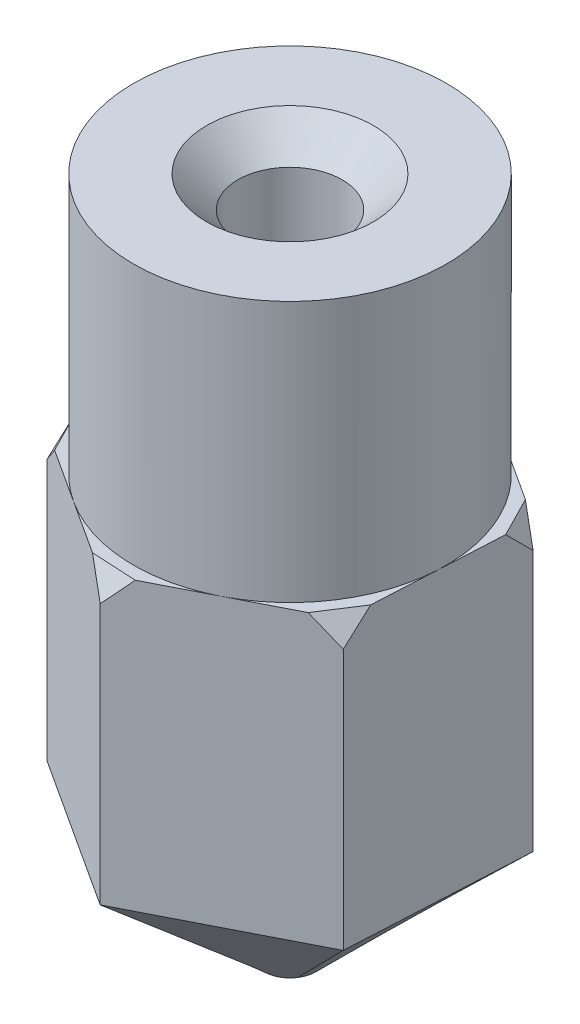
ISO-10303-21;
HEADER;
FILE_DESCRIPTION(('STEP AP214'),'2;1');
FILE_NAME('part.step','',(''),(''),'','','');
FILE_SCHEMA(('AUTOMOTIVE_DESIGN { 1 0 10303 214 1 1 1 1 }'));
ENDSEC;
DATA;
#1=APPLICATION_CONTEXT('core data for automotive mechanical design processes');
#2=APPLICATION_PROTOCOL_DEFINITION('international standard','automotive_design',2000,#1);
#3=PRODUCT_CONTEXT('',#1,'mechanical');
#4=PRODUCT('Part','Part','',(#3));
#5=PRODUCT_RELATED_PRODUCT_CATEGORY('part','',(#4));
#6=PRODUCT_DEFINITION_FORMATION('','',#4);
#7=PRODUCT_DEFINITION_CONTEXT('part definition',#1,'design');
#8=PRODUCT_DEFINITION('design','',#6,#7);
#9=PRODUCT_DEFINITION_SHAPE('','',#8);
#10=(LENGTH_UNIT() NAMED_UNIT(*) SI_UNIT(.MILLI.,.METRE.));
#11=(NAMED_UNIT(*) PLANE_ANGLE_UNIT() SI_UNIT($,.RADIAN.));
#12=(NAMED_UNIT(*) SI_UNIT($,.STERADIAN.) SOLID_ANGLE_UNIT());
#13=UNCERTAINTY_MEASURE_WITH_UNIT(LENGTH_MEASURE(1.E-05),#10,'distance_accuracy_value','');
#14=(GEOMETRIC_REPRESENTATION_CONTEXT(3) GLOBAL_UNCERTAINTY_ASSIGNED_CONTEXT((#13)) GLOBAL_UNIT_ASSIGNED_CONTEXT((#10,
#11,#12)) REPRESENTATION_CONTEXT('',''));
#15=CARTESIAN_POINT('',(0.,0.,0.));
#16=DIRECTION('',(0.,0.,1.));
#17=DIRECTION('',(1.,0.,0.));
#18=AXIS2_PLACEMENT_3D('',#15,#16,#17);
#19=CARTESIAN_POINT('',(0.,5.5,0.));
#20=DIRECTION('',(0.,1.,0.));
#21=DIRECTION('',(0.,0.,1.));
#22=AXIS2_PLACEMENT_3D('',#19,#20,#21);
#23=PLANE('',#22);
#24=DIRECTION('',(0.890736666190286,0.,-0.454519737199845));
#25=VECTOR('',#24,1.);
#26=CARTESIAN_POINT('',(-0.179241950406559,5.5,3.45946127644384));
#27=LINE('',#26,#25);
#28=CARTESIAN_POINT('',(1.36355921159953,5.5,2.67220999857086));
#29=VERTEX_POINT('',#28);
#30=CARTESIAN_POINT('',(2.46099204051048,5.5,2.1122185892978));
#31=VERTEX_POINT('',#30);
#32=EDGE_CURVE('E338',#29,#31,#27,.T.);
#33=ORIENTED_EDGE('',*,*,#32,.T.);
#34=DIRECTION('',(0.544140712403124,0.,-0.838993972031635));
#35=VECTOR('',#34,1.);
#36=CARTESIAN_POINT('',(2.69661188059772,5.5,1.74892354259709));
#37=LINE('',#36,#35);
#38=CARTESIAN_POINT('',(2.93223172068495,5.5,1.38562849589639));
#39=VERTEX_POINT('',#38);
#40=EDGE_CURVE('E102',#31,#39,#37,.T.);
#41=ORIENTED_EDGE('',*,*,#40,.T.);
#42=DIRECTION('',(0.0517426941586506,0.,-0.998660449602969));
#43=VECTOR('',#42,1.);
#44=CARTESIAN_POINT('',(2.90636037360563,5.5,1.88495872069787));
#45=LINE('',#44,#43);
#46=CARTESIAN_POINT('',(2.99598134880891,5.5,0.155228082475952));
#47=VERTEX_POINT('',#46);
#48=EDGE_CURVE('E227',#39,#47,#45,.T.);
#49=ORIENTED_EDGE('',*,*,#48,.T.);
#50=CARTESIAN_POINT('',(0.,5.5,0.));
#51=DIRECTION('',(0.,1.,0.));
#52=DIRECTION('',(0.,0.,1.));
#53=AXIS2_PLACEMENT_3D('',#50,#51,#52);
#54=CIRCLE('',#53,3.);
#55=EDGE_CURVE('E423',#29,#47,#54,.T.);
#56=ORIENTED_EDGE('',*,*,#55,.F.);
#57=EDGE_LOOP('',(#33,#41,#49,#56));
#58=FACE_BOUND('',#57,.T.);
#59=ADVANCED_FACE('F85',(#58),#23,.T.);
#60=DIRECTION('',(0.838993972031635,0.,0.544140712403125));
#61=VECTOR('',#60,1.);
#62=CARTESIAN_POINT('',(-3.08560232401219,5.5,1.57450255574597));
#63=LINE('',#62,#61);
#64=CARTESIAN_POINT('',(-1.63242213720937,5.5,2.5169819160949));
#65=VERTEX_POINT('',#64);
#66=CARTESIAN_POINT('',(-0.598738936422377,5.5,3.18739092024228));
#67=VERTEX_POINT('',#66);
#68=EDGE_CURVE('E342',#65,#67,#63,.T.);
#69=ORIENTED_EDGE('',*,*,#68,.T.);
#70=DIRECTION('',(0.998660449602969,0.,0.0517426941586507));
#71=VECTOR('',#70,1.);
#72=CARTESIAN_POINT('',(-0.166306276866898,5.5,3.2097961640431));
#73=LINE('',#72,#71);
#74=CARTESIAN_POINT('',(0.266126382688585,5.5,3.23220140784392));
#75=VERTEX_POINT('',#74);
#76=EDGE_CURVE('E239',#67,#75,#73,.T.);
#77=ORIENTED_EDGE('',*,*,#76,.T.);
#78=EDGE_CURVE('E221',#75,#29,#27,.T.);
#79=ORIENTED_EDGE('',*,*,#78,.T.);
#80=EDGE_CURVE('E330',#65,#29,#54,.T.);
#81=ORIENTED_EDGE('',*,*,#80,.F.);
#82=EDGE_LOOP('',(#69,#77,#79,#81));
#83=FACE_BOUND('',#82,.T.);
#84=ADVANCED_FACE('F550',(#83),#23,.T.);
#85=DIRECTION('',(-0.0517426941586506,0.,0.998660449602969));
#86=VECTOR('',#85,1.);
#87=CARTESIAN_POINT('',(-2.90636037360563,5.5,-1.88495872069787));
#88=LINE('',#87,#86);
#89=CARTESIAN_POINT('',(-2.9959813488089,5.5,-0.155228082475952));
#90=VERTEX_POINT('',#89);
#91=CARTESIAN_POINT('',(-3.05973097693286,5.5,1.07517233094448));
#92=VERTEX_POINT('',#91);
#93=EDGE_CURVE('E346',#90,#92,#88,.T.);
#94=ORIENTED_EDGE('',*,*,#93,.T.);
#95=DIRECTION('',(0.454519737199845,0.,0.890736666190285));
#96=VECTOR('',#95,1.);
#97=CARTESIAN_POINT('',(-2.86291815746461,5.5,1.46087262144601));
#98=LINE('',#97,#96);
#99=CARTESIAN_POINT('',(-2.66610533799637,5.5,1.84657291194753));
#100=VERTEX_POINT('',#99);
#101=EDGE_CURVE('E257',#92,#100,#98,.T.);
#102=ORIENTED_EDGE('',*,*,#101,.T.);
#103=EDGE_CURVE('E339',#100,#65,#63,.T.);
#104=ORIENTED_EDGE('',*,*,#103,.T.);
#105=EDGE_CURVE('E571',#90,#65,#54,.T.);
#106=ORIENTED_EDGE('',*,*,#105,.F.);
#107=EDGE_LOOP('',(#94,#102,#104,#106));
#108=FACE_BOUND('',#107,.T.);
#109=ADVANCED_FACE('F551',(#108),#23,.T.);
#110=DIRECTION('',(-0.890736666190286,0.,0.454519737199844));
#111=VECTOR('',#110,1.);
#112=CARTESIAN_POINT('',(0.179241950406561,5.5,-3.45946127644384));
#113=LINE('',#112,#111);
#114=CARTESIAN_POINT('',(-1.36355921159953,5.5,-2.67220999857086));
#115=VERTEX_POINT('',#114);
#116=CARTESIAN_POINT('',(-2.46099204051048,5.5,-2.1122185892978));
#117=VERTEX_POINT('',#116);
#118=EDGE_CURVE('E350',#115,#117,#113,.T.);
#119=ORIENTED_EDGE('',*,*,#118,.T.);
#120=DIRECTION('',(-0.544140712403124,0.,0.838993972031635));
#121=VECTOR('',#120,1.);
#122=CARTESIAN_POINT('',(-2.69661188059772,5.5,-1.74892354259709));
#123=LINE('',#122,#121);
#124=CARTESIAN_POINT('',(-2.93223172068495,5.5,-1.38562849589639));
#125=VERTEX_POINT('',#124);
#126=EDGE_CURVE('E269',#117,#125,#123,.T.);
#127=ORIENTED_EDGE('',*,*,#126,.T.);
#128=EDGE_CURVE('E343',#125,#90,#88,.T.);
#129=ORIENTED_EDGE('',*,*,#128,.T.);
#130=EDGE_CURVE('E641',#115,#90,#54,.T.);
#131=ORIENTED_EDGE('',*,*,#130,.F.);
#132=EDGE_LOOP('',(#119,#127,#129,#131));
#133=FACE_BOUND('',#132,.T.);
#134=ADVANCED_FACE('F559',(#133),#23,.T.);
#135=DIRECTION('',(-0.838993972031635,0.,-0.544140712403125));
#136=VECTOR('',#135,1.);
#137=CARTESIAN_POINT('',(3.08560232401219,5.5,-1.57450255574597));
#138=LINE('',#137,#136);
#139=CARTESIAN_POINT('',(1.63242213720937,5.5,-2.51698191609491));
#140=VERTEX_POINT('',#139);
#141=CARTESIAN_POINT('',(0.59873893642238,5.5,-3.18739092024228));
#142=VERTEX_POINT('',#141);
#143=EDGE_CURVE('E354',#140,#142,#138,.T.);
#144=ORIENTED_EDGE('',*,*,#143,.T.);
#145=DIRECTION('',(-0.998660449602969,0.,-0.0517426941586507));
#146=VECTOR('',#145,1.);
#147=CARTESIAN_POINT('',(0.166306276866898,5.5,-3.2097961640431));
#148=LINE('',#147,#146);
#149=CARTESIAN_POINT('',(-0.266126382688582,5.5,-3.23220140784392));
#150=VERTEX_POINT('',#149);
#151=EDGE_CURVE('E281',#142,#150,#148,.T.);
#152=ORIENTED_EDGE('',*,*,#151,.T.);
#153=EDGE_CURVE('E347',#150,#115,#113,.T.);
#154=ORIENTED_EDGE('',*,*,#153,.T.);
#155=EDGE_CURVE('E636',#140,#115,#54,.T.);
#156=ORIENTED_EDGE('',*,*,#155,.F.);
#157=EDGE_LOOP('',(#144,#152,#154,#156));
#158=FACE_BOUND('',#157,.T.);
#159=ADVANCED_FACE('F564',(#158),#23,.T.);
#160=CARTESIAN_POINT('',(3.05973097693286,5.5,-1.07517233094449));
#161=VERTEX_POINT('',#160);
#162=EDGE_CURVE('E313',#47,#161,#45,.T.);
#163=ORIENTED_EDGE('',*,*,#162,.T.);
#164=DIRECTION('',(-0.454519737199845,0.,-0.890736666190285));
#165=VECTOR('',#164,1.);
#166=CARTESIAN_POINT('',(2.86291815746462,5.5,-1.46087262144601));
#167=LINE('',#166,#165);
#168=CARTESIAN_POINT('',(2.66610533799637,5.5,-1.84657291194753));
#169=VERTEX_POINT('',#168);
#170=EDGE_CURVE('E293',#161,#169,#167,.T.);
#171=ORIENTED_EDGE('',*,*,#170,.T.);
#172=EDGE_CURVE('E351',#169,#140,#138,.T.);
#173=ORIENTED_EDGE('',*,*,#172,.T.);
#174=EDGE_CURVE('E297',#47,#140,#54,.T.);
#175=ORIENTED_EDGE('',*,*,#174,.F.);
#176=EDGE_LOOP('',(#163,#171,#173,#175));
#177=FACE_BOUND('',#176,.T.);
#178=ADVANCED_FACE('F556',(#177),#23,.T.);
#179=CARTESIAN_POINT('',(2.90636037360563,5.5,1.88495872069787));
#180=DIRECTION('',(-0.998660449602969,0.,-0.0517426941586506));
#181=DIRECTION('',(-0.0517426941586506,0.,0.998660449602969));
#182=AXIS2_PLACEMENT_3D('',#179,#180,#181);
#183=PLANE('',#182);
#184=DIRECTION('',(0.0365876099164434,0.707106781186547,-0.706159576017066));
#185=VECTOR('',#184,1.);
#186=CARTESIAN_POINT('',(2.91929604714529,5.25,1.63529360829713));
#187=LINE('',#186,#185);
#188=CARTESIAN_POINT('',(2.90636037360563,5.,1.88495872069787));
#189=VERTEX_POINT('',#188);
#190=EDGE_CURVE('E224',#189,#39,#187,.T.);
#191=ORIENTED_EDGE('',*,*,#190,.F.);
#192=DIRECTION('',(0.,-1.,0.));
#193=VECTOR('',#192,1.);
#194=CARTESIAN_POINT('',(2.90636037360563,5.5,1.88495872069787));
#195=LINE('',#194,#193);
#196=CARTESIAN_POINT('',(2.90636037360562,0.,1.88495872069787));
#197=VERTEX_POINT('',#196);
#198=EDGE_CURVE('E211',#189,#197,#195,.T.);
#199=ORIENTED_EDGE('',*,*,#198,.T.);
#200=DIRECTION('',(-0.0517426941586506,0.,0.998660449602969));
#201=VECTOR('',#200,1.);
#202=CARTESIAN_POINT('',(2.90636037360563,0.,1.88495872069787));
#203=LINE('',#202,#201);
#204=CARTESIAN_POINT('',(3.08560232401219,0.,-1.57450255574597));
#205=VERTEX_POINT('',#204);
#206=EDGE_CURVE('E314',#197,#205,#203,.F.);
#207=ORIENTED_EDGE('',*,*,#206,.T.);
#208=DIRECTION('',(0.,-1.,0.));
#209=VECTOR('',#208,1.);
#210=CARTESIAN_POINT('',(3.08560232401219,5.5,-1.57450255574597));
#211=LINE('',#210,#209);
#212=CARTESIAN_POINT('',(3.08560232401219,5.,-1.57450255574597));
#213=VERTEX_POINT('',#212);
#214=EDGE_CURVE('E327',#213,#205,#211,.T.);
#215=ORIENTED_EDGE('',*,*,#214,.F.);
#216=DIRECTION('',(0.0365876099164434,-0.707106781186548,-0.706159576017065));
#217=VECTOR('',#216,1.);
#218=CARTESIAN_POINT('',(2.98304567526924,6.98205080756888,0.404893194876692));
#219=LINE('',#218,#217);
#220=EDGE_CURVE('E289',#161,#213,#219,.T.);
#221=ORIENTED_EDGE('',*,*,#220,.F.);
#222=ORIENTED_EDGE('',*,*,#162,.F.);
#223=ORIENTED_EDGE('',*,*,#48,.F.);
#224=EDGE_LOOP('',(#191,#199,#207,#215,#221,#222,#223));
#225=FACE_BOUND('',#224,.T.);
#226=ADVANCED_FACE('F225',(#225),#183,.F.);
#227=CARTESIAN_POINT('',(3.08560232401219,5.5,-1.57450255574597));
#228=DIRECTION('',(-0.544140712403125,0.,0.838993972031635));
#229=DIRECTION('',(0.838993972031635,0.,0.544140712403125));
#230=AXIS2_PLACEMENT_3D('',#227,#228,#229);
#231=PLANE('',#230);
#232=DIRECTION('',(-0.593258326998205,-0.707106781186548,-0.384765587659928));
#233=VECTOR('',#232,1.);
#234=CARTESIAN_POINT('',(1.84217063021728,6.98205080756888,-2.38094673799413));
#235=LINE('',#234,#233);
#236=CARTESIAN_POINT('',(0.179241950406561,5.,-3.45946127644384));
#237=VERTEX_POINT('',#236);
#238=EDGE_CURVE('E277',#142,#237,#235,.T.);
#239=ORIENTED_EDGE('',*,*,#238,.F.);
#240=ORIENTED_EDGE('',*,*,#143,.F.);
#241=ORIENTED_EDGE('',*,*,#172,.F.);
#242=DIRECTION('',(-0.593258326998206,0.707106781186547,-0.384765587659928));
#243=VECTOR('',#242,1.);
#244=CARTESIAN_POINT('',(2.87585383100428,5.25,-1.71053773384675));
#245=LINE('',#244,#243);
#246=EDGE_CURVE('E285',#213,#169,#245,.T.);
#247=ORIENTED_EDGE('',*,*,#246,.F.);
#248=ORIENTED_EDGE('',*,*,#214,.T.);
#249=DIRECTION('',(0.838993972031635,0.,0.544140712403125));
#250=VECTOR('',#249,1.);
#251=CARTESIAN_POINT('',(3.08560232401219,0.,-1.57450255574597));
#252=LINE('',#251,#250);
#253=CARTESIAN_POINT('',(0.17924195040656,0.,-3.45946127644384));
#254=VERTEX_POINT('',#253);
#255=EDGE_CURVE('E303',#205,#254,#252,.F.);
#256=ORIENTED_EDGE('',*,*,#255,.T.);
#257=DIRECTION('',(0.,-1.,0.));
#258=VECTOR('',#257,1.);
#259=CARTESIAN_POINT('',(0.179241950406561,5.5,-3.45946127644384));
#260=LINE('',#259,#258);
#261=EDGE_CURVE('E331',#237,#254,#260,.T.);
#262=ORIENTED_EDGE('',*,*,#261,.F.);
#263=EDGE_LOOP('',(#239,#240,#241,#247,#248,#256,#262));
#264=FACE_BOUND('',#263,.T.);
#265=ADVANCED_FACE('F599',(#264),#231,.F.);
#266=CARTESIAN_POINT('',(0.179241950406561,5.5,-3.45946127644384));
#267=DIRECTION('',(0.454519737199844,0.,0.890736666190286));
#268=DIRECTION('',(0.890736666190286,0.,-0.454519737199844));
#269=AXIS2_PLACEMENT_3D('',#266,#267,#268);
#270=PLANE('',#269);
#271=DIRECTION('',(-0.629845936914649,-0.707106781186548,0.321393988357137));
#272=VECTOR('',#271,1.);
#273=CARTESIAN_POINT('',(-1.14087504505196,6.98205080756888,-2.78583993287082));
#274=LINE('',#273,#272);
#275=CARTESIAN_POINT('',(-2.90636037360563,5.,-1.88495872069787));
#276=VERTEX_POINT('',#275);
#277=EDGE_CURVE('E265',#117,#276,#274,.T.);
#278=ORIENTED_EDGE('',*,*,#277,.F.);
#279=ORIENTED_EDGE('',*,*,#118,.F.);
#280=ORIENTED_EDGE('',*,*,#153,.F.);
#281=DIRECTION('',(-0.629845936914649,0.707106781186548,0.321393988357137));
#282=VECTOR('',#281,1.);
#283=CARTESIAN_POINT('',(-0.0434422161410111,5.25,-3.34583134214388));
#284=LINE('',#283,#282);
#285=EDGE_CURVE('E273',#237,#150,#284,.T.);
#286=ORIENTED_EDGE('',*,*,#285,.F.);
#287=ORIENTED_EDGE('',*,*,#261,.T.);
#288=DIRECTION('',(0.890736666190286,0.,-0.454519737199844));
#289=VECTOR('',#288,1.);
#290=CARTESIAN_POINT('',(0.179241950406561,0.,-3.45946127644384));
#291=LINE('',#290,#289);
#292=CARTESIAN_POINT('',(-2.90636037360563,0.,-1.88495872069787));
#293=VERTEX_POINT('',#292);
#294=EDGE_CURVE('E298',#254,#293,#291,.F.);
#295=ORIENTED_EDGE('',*,*,#294,.T.);
#296=DIRECTION('',(0.,-1.,0.));
#297=VECTOR('',#296,1.);
#298=CARTESIAN_POINT('',(-2.90636037360563,5.5,-1.88495872069787));
#299=LINE('',#298,#297);
#300=EDGE_CURVE('E324',#276,#293,#299,.T.);
#301=ORIENTED_EDGE('',*,*,#300,.F.);
#302=EDGE_LOOP('',(#278,#279,#280,#286,#287,#295,#301));
#303=FACE_BOUND('',#302,.T.);
#304=ADVANCED_FACE('F588',(#303),#270,.F.);
#305=CARTESIAN_POINT('',(-2.90636037360563,5.5,-1.88495872069787));
#306=DIRECTION('',(0.998660449602969,0.,0.0517426941586506));
#307=DIRECTION('',(0.0517426941586506,0.,-0.998660449602969));
#308=AXIS2_PLACEMENT_3D('',#305,#306,#307);
#309=PLANE('',#308);
#310=DIRECTION('',(-0.0365876099164434,-0.707106781186548,0.706159576017065));
#311=VECTOR('',#310,1.);
#312=CARTESIAN_POINT('',(-2.98304567526924,6.98205080756888,-0.404893194876693));
#313=LINE('',#312,#311);
#314=CARTESIAN_POINT('',(-3.08560232401219,5.,1.57450255574597));
#315=VERTEX_POINT('',#314);
#316=EDGE_CURVE('E253',#92,#315,#313,.T.);
#317=ORIENTED_EDGE('',*,*,#316,.F.);
#318=ORIENTED_EDGE('',*,*,#93,.F.);
#319=ORIENTED_EDGE('',*,*,#128,.F.);
#320=DIRECTION('',(-0.0365876099164434,0.707106781186547,0.706159576017066));
#321=VECTOR('',#320,1.);
#322=CARTESIAN_POINT('',(-2.91929604714529,5.25,-1.63529360829713));
#323=LINE('',#322,#321);
#324=EDGE_CURVE('E261',#276,#125,#323,.T.);
#325=ORIENTED_EDGE('',*,*,#324,.F.);
#326=ORIENTED_EDGE('',*,*,#300,.T.);
#327=DIRECTION('',(0.0517426941586506,0.,-0.998660449602969));
#328=VECTOR('',#327,1.);
#329=CARTESIAN_POINT('',(-2.90636037360563,0.,-1.88495872069787));
#330=LINE('',#329,#328);
#331=CARTESIAN_POINT('',(-3.08560232401219,0.,1.57450255574597));
#332=VERTEX_POINT('',#331);
#333=EDGE_CURVE('E302',#293,#332,#330,.F.);
#334=ORIENTED_EDGE('',*,*,#333,.T.);
#335=DIRECTION('',(0.,-1.,0.));
#336=VECTOR('',#335,1.);
#337=CARTESIAN_POINT('',(-3.08560232401219,5.5,1.57450255574597));
#338=LINE('',#337,#336);
#339=EDGE_CURVE('E321',#315,#332,#338,.T.);
#340=ORIENTED_EDGE('',*,*,#339,.F.);
#341=EDGE_LOOP('',(#317,#318,#319,#325,#326,#334,#340));
#342=FACE_BOUND('',#341,.T.);
#343=ADVANCED_FACE('F583',(#342),#309,.F.);
#344=CARTESIAN_POINT('',(-3.08560232401219,5.5,1.57450255574597));
#345=DIRECTION('',(0.544140712403125,0.,-0.838993972031635));
#346=DIRECTION('',(-0.838993972031635,0.,-0.544140712403125));
#347=AXIS2_PLACEMENT_3D('',#344,#345,#346);
#348=PLANE('',#347);
#349=DIRECTION('',(0.593258326998205,-0.707106781186548,0.384765587659928));
#350=VECTOR('',#349,1.);
#351=CARTESIAN_POINT('',(-1.84217063021728,6.98205080756888,2.38094673799412));
#352=LINE('',#351,#350);
#353=CARTESIAN_POINT('',(-0.179241950406559,5.,3.45946127644384));
#354=VERTEX_POINT('',#353);
#355=EDGE_CURVE('E246',#67,#354,#352,.T.);
#356=ORIENTED_EDGE('',*,*,#355,.F.);
#357=ORIENTED_EDGE('',*,*,#68,.F.);
#358=ORIENTED_EDGE('',*,*,#103,.F.);
#359=DIRECTION('',(0.593258326998206,0.707106781186547,0.384765587659928));
#360=VECTOR('',#359,1.);
#361=CARTESIAN_POINT('',(-2.87585383100428,5.25,1.71053773384675));
#362=LINE('',#361,#360);
#363=EDGE_CURVE('E249',#315,#100,#362,.T.);
#364=ORIENTED_EDGE('',*,*,#363,.F.);
#365=ORIENTED_EDGE('',*,*,#339,.T.);
#366=DIRECTION('',(-0.838993972031635,0.,-0.544140712403125));
#367=VECTOR('',#366,1.);
#368=CARTESIAN_POINT('',(-3.08560232401219,0.,1.57450255574597));
#369=LINE('',#368,#367);
#370=CARTESIAN_POINT('',(-0.179241950406558,0.,3.45946127644384));
#371=VERTEX_POINT('',#370);
#372=EDGE_CURVE('E307',#332,#371,#369,.F.);
#373=ORIENTED_EDGE('',*,*,#372,.T.);
#374=DIRECTION('',(0.,-1.,0.));
#375=VECTOR('',#374,1.);
#376=CARTESIAN_POINT('',(-0.179241950406559,5.5,3.45946127644384));
#377=LINE('',#376,#375);
#378=EDGE_CURVE('E220',#354,#371,#377,.T.);
#379=ORIENTED_EDGE('',*,*,#378,.F.);
#380=EDGE_LOOP('',(#356,#357,#358,#364,#365,#373,#379));
#381=FACE_BOUND('',#380,.T.);
#382=ADVANCED_FACE('F580',(#381),#348,.F.);
#383=CARTESIAN_POINT('',(-0.179241950406559,5.5,3.45946127644384));
#384=DIRECTION('',(-0.454519737199845,0.,-0.890736666190286));
#385=DIRECTION('',(-0.890736666190286,0.,0.454519737199845));
#386=AXIS2_PLACEMENT_3D('',#383,#384,#385);
#387=PLANE('',#386);
#388=DIRECTION('',(0.629845936914649,-0.707106781186548,-0.321393988357138));
#389=VECTOR('',#388,1.);
#390=CARTESIAN_POINT('',(1.14087504505196,6.98205080756887,2.78583993287082));
#391=LINE('',#390,#389);
#392=EDGE_CURVE('E110',#31,#189,#391,.T.);
#393=ORIENTED_EDGE('',*,*,#392,.F.);
#394=ORIENTED_EDGE('',*,*,#32,.F.);
#395=ORIENTED_EDGE('',*,*,#78,.F.);
#396=DIRECTION('',(0.629845936914648,0.707106781186548,-0.321393988357137));
#397=VECTOR('',#396,1.);
#398=CARTESIAN_POINT('',(0.0434422161410131,5.25,3.34583134214388));
#399=LINE('',#398,#397);
#400=EDGE_CURVE('E243',#354,#75,#399,.T.);
#401=ORIENTED_EDGE('',*,*,#400,.F.);
#402=ORIENTED_EDGE('',*,*,#378,.T.);
#403=DIRECTION('',(-0.890736666190286,0.,0.454519737199845));
#404=VECTOR('',#403,1.);
#405=CARTESIAN_POINT('',(-0.179241950406559,0.,3.45946127644384));
#406=LINE('',#405,#404);
#407=EDGE_CURVE('E215',#371,#197,#406,.F.);
#408=ORIENTED_EDGE('',*,*,#407,.T.);
#409=ORIENTED_EDGE('',*,*,#198,.F.);
#410=EDGE_LOOP('',(#393,#394,#395,#401,#402,#408,#409));
#411=FACE_BOUND('',#410,.T.);
#412=ADVANCED_FACE('F213',(#411),#387,.F.);
#413=CARTESIAN_POINT('',(0.,-2.5,0.));
#414=DIRECTION('',(0.,-1.,0.));
#415=DIRECTION('',(0.,0.,-1.));
#416=AXIS2_PLACEMENT_3D('',#413,#414,#415);
#417=PLANE('',#416);
#418=CARTESIAN_POINT('',(0.,-2.5,0.));
#419=DIRECTION('',(0.,-1.,0.));
#420=DIRECTION('',(0.,0.,-1.));
#421=AXIS2_PLACEMENT_3D('',#418,#419,#420);
#422=CIRCLE('',#421,0.2);
#423=CARTESIAN_POINT('',(0.,-2.5,-0.2));
#424=VERTEX_POINT('',#423);
#425=EDGE_CURVE('E853',#424,#424,#422,.T.);
#426=ORIENTED_EDGE('',*,*,#425,.F.);
#427=EDGE_LOOP('',(#426));
#428=FACE_BOUND('',#427,.T.);
#429=CARTESIAN_POINT('',(0.,-2.5,0.));
#430=DIRECTION('',(0.,-1.,0.));
#431=DIRECTION('',(0.,0.,-1.));
#432=AXIS2_PLACEMENT_3D('',#429,#430,#431);
#433=CIRCLE('',#432,0.5);
#434=CARTESIAN_POINT('',(-0.419496986015818,-2.5,-0.272070356201562));
#435=VERTEX_POINT('',#434);
#436=CARTESIAN_POINT('',(0.0258713470793253,-2.5,-0.499330224801485));
#437=VERTEX_POINT('',#436);
#438=EDGE_CURVE('E433',#435,#437,#433,.T.);
#439=ORIENTED_EDGE('',*,*,#438,.T.);
#440=CARTESIAN_POINT('',(0.445368333095143,-2.5,-0.227259868599923));
#441=VERTEX_POINT('',#440);
#442=EDGE_CURVE('E435',#437,#441,#433,.T.);
#443=ORIENTED_EDGE('',*,*,#442,.T.);
#444=CARTESIAN_POINT('',(0.419496986015817,-2.5,0.272070356201563));
#445=VERTEX_POINT('',#444);
#446=EDGE_CURVE('E436',#441,#445,#433,.T.);
#447=ORIENTED_EDGE('',*,*,#446,.T.);
#448=CARTESIAN_POINT('',(-0.025871347079325,-2.5,0.499330224801485));
#449=VERTEX_POINT('',#448);
#450=EDGE_CURVE('E418',#445,#449,#433,.T.);
#451=ORIENTED_EDGE('',*,*,#450,.T.);
#452=CARTESIAN_POINT('',(-0.445368333095143,-2.5,0.227259868599923));
#453=VERTEX_POINT('',#452);
#454=EDGE_CURVE('E410',#449,#453,#433,.T.);
#455=ORIENTED_EDGE('',*,*,#454,.T.);
#456=EDGE_CURVE('E419',#453,#435,#433,.T.);
#457=ORIENTED_EDGE('',*,*,#456,.T.);
#458=EDGE_LOOP('',(#439,#443,#447,#451,#455,#457));
#459=FACE_BOUND('',#458,.T.);
#460=ADVANCED_FACE('F363',(#428,#459),#417,.T.);
#461=CARTESIAN_POINT('',(-0.419496986015818,-2.5,-0.272070356201562));
#462=CARTESIAN_POINT('',(-2.90636037360563,0.,-1.88495872069787));
#463=CARTESIAN_POINT('',(-0.464842045382745,-2.5,-0.202154191865592));
#464=CARTESIAN_POINT('',(-2.93623403200672,0.,-1.30838184129057));
#465=CARTESIAN_POINT('',(-0.494708753763478,-2.5,-0.115068100740664));
#466=CARTESIAN_POINT('',(-2.96610769040781,0.,-0.73180496188326));
#467=CARTESIAN_POINT('',(-0.503951695839492,-2.5,0.0633254065820142));
#468=CARTESIAN_POINT('',(-3.02585500721,0.,0.421348796931353));
#469=CARTESIAN_POINT('',(-0.483244977861796,-2.5,0.153031813084065));
#470=CARTESIAN_POINT('',(-3.05572866561109,0.,0.99792567633866));
#471=CARTESIAN_POINT('',(-0.445368333095143,-2.5,0.227259868599923));
#472=CARTESIAN_POINT('',(-3.08560232401219,0.,1.57450255574597));
#473=B_SPLINE_SURFACE_WITH_KNOTS('',3,1,((#461,#462),(#463,#464),(#465,#466),(#467,#468),(#469,
#470),(#471,#472)),.UNSPECIFIED.,.F.,.F.,.F.,(4,2,4),(2,2),(0.,0.5,1.),(0.,1.),.UNSPECIFIED.);
#474=DIRECTION('',(-0.68089120886756,0.644726197763122,0.347441062059136));
#475=VECTOR('',#474,1.);
#476=CARTESIAN_POINT('',(-1.76548532855366,-1.25,0.900881212172945));
#477=LINE('',#476,#475);
#478=EDGE_CURVE('E449',#453,#332,#477,.T.);
#479=DIRECTION('',(0.641338390494838,-0.644726197763122,0.415948553063235));
#480=VECTOR('',#479,1.);
#481=CARTESIAN_POINT('',(-1.66292867981072,-1.25,-1.07851453844972));
#482=LINE('',#481,#480);
#483=EDGE_CURVE('E446',#293,#435,#482,.T.);
#484=ORIENTED_EDGE('',*,*,#456,.F.);
#485=ORIENTED_EDGE('',*,*,#478,.T.);
#486=ORIENTED_EDGE('',*,*,#333,.F.);
#487=ORIENTED_EDGE('',*,*,#483,.T.);
#488=EDGE_LOOP('',(#484,#485,#486,#487));
#489=FACE_BOUND('',#488,.T.);
#490=ADVANCED_FACE('F373',(#489),#473,.T.);
#491=CARTESIAN_POINT('',(-0.445368333095143,-2.5,0.227259868599923));
#492=CARTESIAN_POINT('',(-3.08560232401219,0.,1.57450255574597));
#493=CARTESIAN_POINT('',(-0.407491688328489,-2.5,0.30148792411578));
#494=CARTESIAN_POINT('',(-2.60120892841125,0.,1.88866234252895));
#495=CARTESIAN_POINT('',(-0.347006275288381,-2.5,0.37089629786338));
#496=CARTESIAN_POINT('',(-2.11681553281031,0.,2.20282212931193));
#497=CARTESIAN_POINT('',(-0.197134437114743,-2.5,0.468097674168255));
#498=CARTESIAN_POINT('',(-1.14802874160843,0.,2.83114170287788));
#499=CARTESIAN_POINT('',(-0.109093051212906,-2.5,0.495018333621597));
#500=CARTESIAN_POINT('',(-0.663635346007496,0.,3.14530148966086));
#501=CARTESIAN_POINT('',(-0.025871347079325,-2.5,0.499330224801485));
#502=CARTESIAN_POINT('',(-0.179241950406559,0.,3.45946127644384));
#503=B_SPLINE_SURFACE_WITH_KNOTS('',3,1,((#491,#492),(#493,#494),(#495,#496),(#497,#498),(#499,
#500),(#501,#502)),.UNSPECIFIED.,.F.,.F.,.F.,(4,2,4),(2,2),(0.,0.5,1.),(0.,1.),.UNSPECIFIED.);
#504=DIRECTION('',(-0.0395528183727214,0.644726197763122,0.763389615122371));
#505=VECTOR('',#504,1.);
#506=CARTESIAN_POINT('',(-0.102556648742942,-1.25,1.97939575062266));
#507=LINE('',#506,#505);
#508=EDGE_CURVE('E456',#449,#371,#507,.T.);
#509=ORIENTED_EDGE('',*,*,#454,.F.);
#510=ORIENTED_EDGE('',*,*,#508,.T.);
#511=ORIENTED_EDGE('',*,*,#372,.F.);
#512=ORIENTED_EDGE('',*,*,#478,.F.);
#513=EDGE_LOOP('',(#509,#510,#511,#512));
#514=FACE_BOUND('',#513,.T.);
#515=ADVANCED_FACE('F528',(#514),#503,.T.);
#516=CARTESIAN_POINT('',(0.0258713470793255,-2.5,-0.499330224801485));
#517=CARTESIAN_POINT('',(0.179241950406561,0.,-3.45946127644384));
#518=CARTESIAN_POINT('',(-0.0573503570542552,-2.5,-0.503642115981372));
#519=CARTESIAN_POINT('',(-0.33502510359547,0.,-3.19704418381951));
#520=CARTESIAN_POINT('',(-0.147702478475096,-2.5,-0.485964398604044));
#521=CARTESIAN_POINT('',(-0.849292157597501,0.,-2.93462709119518));
#522=CARTESIAN_POINT('',(-0.306817258724748,-2.5,-0.404772267586241));
#523=CARTESIAN_POINT('',(-1.87782626560156,0.,-2.40979290594653));
#524=CARTESIAN_POINT('',(-0.374151926648891,-2.5,-0.341986520537532));
#525=CARTESIAN_POINT('',(-2.39209331960359,0.,-2.1473758133222));
#526=CARTESIAN_POINT('',(-0.419496986015818,-2.5,-0.272070356201562));
#527=CARTESIAN_POINT('',(-2.90636037360563,0.,-1.88495872069787));
#528=B_SPLINE_SURFACE_WITH_KNOTS('',3,1,((#516,#517),(#518,#519),(#520,#521),(#522,#523),(#524,
#525),(#526,#527)),.UNSPECIFIED.,.F.,.F.,.F.,(4,2,4),(2,2),(0.,0.5,1.),(0.,1.),.UNSPECIFIED.);
#529=DIRECTION('',(0.039552818372722,0.644726197763122,-0.763389615122371));
#530=VECTOR('',#529,1.);
#531=CARTESIAN_POINT('',(0.102556648742943,-1.25,-1.97939575062266));
#532=LINE('',#531,#530);
#533=EDGE_CURVE('E317',#437,#254,#532,.T.);
#534=ORIENTED_EDGE('',*,*,#438,.F.);
#535=ORIENTED_EDGE('',*,*,#483,.F.);
#536=ORIENTED_EDGE('',*,*,#294,.F.);
#537=ORIENTED_EDGE('',*,*,#533,.F.);
#538=EDGE_LOOP('',(#534,#535,#536,#537));
#539=FACE_BOUND('',#538,.T.);
#540=ADVANCED_FACE('F488',(#539),#528,.T.);
#541=CARTESIAN_POINT('',(-0.025871347079325,-2.5,0.499330224801485));
#542=CARTESIAN_POINT('',(-0.179241950406559,0.,3.45946127644384));
#543=CARTESIAN_POINT('',(0.0573503570542557,-2.5,0.503642115981372));
#544=CARTESIAN_POINT('',(0.335025103595472,0.,3.19704418381951));
#545=CARTESIAN_POINT('',(0.147702478475096,-2.5,0.485964398604044));
#546=CARTESIAN_POINT('',(0.849292157597503,0.,2.93462709119518));
#547=CARTESIAN_POINT('',(0.306817258724748,-2.5,0.404772267586241));
#548=CARTESIAN_POINT('',(1.87782626560156,0.,2.40979290594653));
#549=CARTESIAN_POINT('',(0.37415192664889,-2.5,0.341986520537532));
#550=CARTESIAN_POINT('',(2.39209331960359,0.,2.1473758133222));
#551=CARTESIAN_POINT('',(0.419496986015817,-2.5,0.272070356201563));
#552=CARTESIAN_POINT('',(2.90636037360562,0.,1.88495872069787));
#553=B_SPLINE_SURFACE_WITH_KNOTS('',3,1,((#541,#542),(#543,#544),(#545,#546),(#547,#548),(#549,
#550),(#551,#552)),.UNSPECIFIED.,.F.,.F.,.F.,(4,2,4),(2,2),(0.,0.5,1.),(0.,1.),.UNSPECIFIED.);
#554=DIRECTION('',(0.641338390494838,0.644726197763122,0.415948553063235));
#555=VECTOR('',#554,1.);
#556=CARTESIAN_POINT('',(1.66292867981072,-1.25,1.07851453844972));
#557=LINE('',#556,#555);
#558=EDGE_CURVE('E614',#445,#197,#557,.T.);
#559=ORIENTED_EDGE('',*,*,#450,.F.);
#560=ORIENTED_EDGE('',*,*,#558,.T.);
#561=ORIENTED_EDGE('',*,*,#407,.F.);
#562=ORIENTED_EDGE('',*,*,#508,.F.);
#563=EDGE_LOOP('',(#559,#560,#561,#562));
#564=FACE_BOUND('',#563,.T.);
#565=ADVANCED_FACE('F475',(#564),#553,.T.);
#566=CARTESIAN_POINT('',(0.419496986015817,-2.5,0.272070356201563));
#567=CARTESIAN_POINT('',(2.90636037360563,0.,1.88495872069787));
#568=CARTESIAN_POINT('',(0.464842045382744,-2.5,0.202154191865593));
#569=CARTESIAN_POINT('',(2.93623403200672,0.,1.30838184129057));
#570=CARTESIAN_POINT('',(0.494708753763478,-2.5,0.115068100740665));
#571=CARTESIAN_POINT('',(2.96610769040781,0.,0.731804961883259));
#572=CARTESIAN_POINT('',(0.503951695839492,-2.5,-0.0633254065820139));
#573=CARTESIAN_POINT('',(3.02585500721,0.,-0.421348796931355));
#574=CARTESIAN_POINT('',(0.483244977861797,-2.5,-0.153031813084065));
#575=CARTESIAN_POINT('',(3.05572866561109,0.,-0.997925676338662));
#576=CARTESIAN_POINT('',(0.445368333095143,-2.5,-0.227259868599923));
#577=CARTESIAN_POINT('',(3.08560232401219,0.,-1.57450255574597));
#578=B_SPLINE_SURFACE_WITH_KNOTS('',3,1,((#566,#567),(#568,#569),(#570,#571),(#572,#573),(#574,
#575),(#576,#577)),.UNSPECIFIED.,.F.,.F.,.F.,(4,2,4),(2,2),(0.,0.5,1.),(0.,1.),.UNSPECIFIED.);
#579=DIRECTION('',(0.680891208867559,0.644726197763122,-0.347441062059137));
#580=VECTOR('',#579,1.);
#581=CARTESIAN_POINT('',(1.76548532855366,-1.25,-0.900881212172946));
#582=LINE('',#581,#580);
#583=EDGE_CURVE('E596',#441,#205,#582,.T.);
#584=ORIENTED_EDGE('',*,*,#446,.F.);
#585=ORIENTED_EDGE('',*,*,#583,.T.);
#586=ORIENTED_EDGE('',*,*,#206,.F.);
#587=ORIENTED_EDGE('',*,*,#558,.F.);
#588=EDGE_LOOP('',(#584,#585,#586,#587));
#589=FACE_BOUND('',#588,.T.);
#590=ADVANCED_FACE('F487',(#589),#578,.T.);
#591=CARTESIAN_POINT('',(0.445368333095143,-2.5,-0.227259868599922));
#592=CARTESIAN_POINT('',(3.08560232401219,0.,-1.57450255574597));
#593=CARTESIAN_POINT('',(0.407491688328489,-2.5,-0.301487924115779));
#594=CARTESIAN_POINT('',(2.60120892841125,0.,-1.88866234252895));
#595=CARTESIAN_POINT('',(0.347006275288381,-2.5,-0.37089629786338));
#596=CARTESIAN_POINT('',(2.11681553281031,0.,-2.20282212931193));
#597=CARTESIAN_POINT('',(0.197134437114743,-2.5,-0.468097674168255));
#598=CARTESIAN_POINT('',(1.14802874160844,0.,-2.83114170287788));
#599=CARTESIAN_POINT('',(0.109093051212906,-2.5,-0.495018333621597));
#600=CARTESIAN_POINT('',(0.663635346007501,0.,-3.14530148966086));
#601=CARTESIAN_POINT('',(0.0258713470793253,-2.5,-0.499330224801485));
#602=CARTESIAN_POINT('',(0.179241950406561,0.,-3.45946127644384));
#603=B_SPLINE_SURFACE_WITH_KNOTS('',3,1,((#591,#592),(#593,#594),(#595,#596),(#597,#598),(#599,
#600),(#601,#602)),.UNSPECIFIED.,.F.,.F.,.F.,(4,2,4),(2,2),(0.,0.5,1.),(0.,1.),.UNSPECIFIED.);
#604=ORIENTED_EDGE('',*,*,#442,.F.);
#605=ORIENTED_EDGE('',*,*,#533,.T.);
#606=ORIENTED_EDGE('',*,*,#255,.F.);
#607=ORIENTED_EDGE('',*,*,#583,.F.);
#608=EDGE_LOOP('',(#604,#605,#606,#607));
#609=FACE_BOUND('',#608,.T.);
#610=ADVANCED_FACE('F502',(#609),#603,.T.);
#611=CARTESIAN_POINT('',(0.,10.5,0.));
#612=DIRECTION('',(0.,-1.,0.));
#613=DIRECTION('',(0.,0.,-1.));
#614=AXIS2_PLACEMENT_3D('',#611,#612,#613);
#615=CYLINDRICAL_SURFACE('',#614,3.);
#616=CARTESIAN_POINT('',(0.,10.5,0.));
#617=DIRECTION('',(0.,1.,0.));
#618=DIRECTION('',(0.,0.,1.));
#619=AXIS2_PLACEMENT_3D('',#616,#617,#618);
#620=CIRCLE('',#619,3.);
#621=CARTESIAN_POINT('',(0.,10.5,3.));
#622=VERTEX_POINT('',#621);
#623=EDGE_CURVE('E649',#622,#622,#620,.T.);
#624=ORIENTED_EDGE('',*,*,#623,.F.);
#625=EDGE_LOOP('',(#624));
#626=FACE_BOUND('',#625,.T.);
#627=ORIENTED_EDGE('',*,*,#55,.T.);
#628=ORIENTED_EDGE('',*,*,#174,.T.);
#629=ORIENTED_EDGE('',*,*,#155,.T.);
#630=ORIENTED_EDGE('',*,*,#130,.T.);
#631=ORIENTED_EDGE('',*,*,#105,.T.);
#632=ORIENTED_EDGE('',*,*,#80,.T.);
#633=EDGE_LOOP('',(#627,#628,#629,#630,#631,#632));
#634=FACE_BOUND('',#633,.T.);
#635=ADVANCED_FACE('F375',(#626,#634),#615,.T.);
#636=CARTESIAN_POINT('',(0.,10.5,0.));
#637=DIRECTION('',(0.,1.,0.));
#638=DIRECTION('',(0.,0.,1.));
#639=AXIS2_PLACEMENT_3D('',#636,#637,#638);
#640=PLANE('',#639);
#641=CARTESIAN_POINT('',(0.,10.5,0.));
#642=DIRECTION('',(0.,1.,0.));
#643=DIRECTION('',(0.,0.,1.));
#644=AXIS2_PLACEMENT_3D('',#641,#642,#643);
#645=CIRCLE('',#644,1.59999999999999);
#646=CARTESIAN_POINT('',(0.,10.5,1.59999999999999));
#647=VERTEX_POINT('',#646);
#648=EDGE_CURVE('E12',#647,#647,#645,.F.);
#649=ORIENTED_EDGE('',*,*,#648,.T.);
#650=EDGE_LOOP('',(#649));
#651=FACE_BOUND('',#650,.T.);
#652=ORIENTED_EDGE('',*,*,#623,.T.);
#653=EDGE_LOOP('',(#652));
#654=FACE_BOUND('',#653,.T.);
#655=ADVANCED_FACE('F660',(#651,#654),#640,.T.);
#656=CARTESIAN_POINT('',(4.24995519159032,2.3856406460551,-2.16864151899647));
#657=DIRECTION('',(0.796699094261207,0.447213595499958,-0.406534811797677));
#658=DIRECTION('',(-0.489488091597962,0.872009981699628,0.));
#659=AXIS2_PLACEMENT_3D('',#656,#657,#658);
#660=PLANE('',#659);
#661=ORIENTED_EDGE('',*,*,#170,.F.);
#662=ORIENTED_EDGE('',*,*,#220,.T.);
#663=ORIENTED_EDGE('',*,*,#246,.T.);
#664=EDGE_LOOP('',(#661,#662,#663));
#665=FACE_BOUND('',#664,.T.);
#666=ADVANCED_FACE('F604',(#665),#660,.T.);
#667=CARTESIAN_POINT('',(0.24687894864255,2.3856406460551,-4.76488992036101));
#668=DIRECTION('',(0.0462800725910897,0.447213595499957,-0.893229060701097));
#669=DIRECTION('',(0.,0.894187179234152,0.44769329735129));
#670=AXIS2_PLACEMENT_3D('',#667,#668,#669);
#671=PLANE('',#670);
#672=ORIENTED_EDGE('',*,*,#151,.F.);
#673=ORIENTED_EDGE('',*,*,#238,.T.);
#674=ORIENTED_EDGE('',*,*,#285,.T.);
#675=EDGE_LOOP('',(#672,#673,#674));
#676=FACE_BOUND('',#675,.T.);
#677=ADVANCED_FACE('F638',(#676),#671,.T.);
#678=CARTESIAN_POINT('',(-4.00307624294777,2.3856406460551,-2.59624840136455));
#679=DIRECTION('',(-0.750419021670117,0.447213595499958,-0.48669424890342));
#680=DIRECTION('',(-0.544140712403124,0.,0.838993972031635));
#681=AXIS2_PLACEMENT_3D('',#678,#679,#680);
#682=PLANE('',#681);
#683=ORIENTED_EDGE('',*,*,#126,.F.);
#684=ORIENTED_EDGE('',*,*,#277,.T.);
#685=ORIENTED_EDGE('',*,*,#324,.T.);
#686=EDGE_LOOP('',(#683,#684,#685));
#687=FACE_BOUND('',#686,.T.);
#688=ADVANCED_FACE('F764',(#687),#682,.T.);
#689=CARTESIAN_POINT('',(-4.24995519159032,2.3856406460551,2.16864151899646));
#690=DIRECTION('',(-0.796699094261207,0.447213595499958,0.406534811797677));
#691=DIRECTION('',(-0.489488091597962,-0.872009981699628,0.));
#692=AXIS2_PLACEMENT_3D('',#689,#690,#691);
#693=PLANE('',#692);
#694=ORIENTED_EDGE('',*,*,#101,.F.);
#695=ORIENTED_EDGE('',*,*,#316,.T.);
#696=ORIENTED_EDGE('',*,*,#363,.T.);
#697=EDGE_LOOP('',(#694,#695,#696));
#698=FACE_BOUND('',#697,.T.);
#699=ADVANCED_FACE('F576',(#698),#693,.T.);
#700=CARTESIAN_POINT('',(-0.24687894864255,2.3856406460551,4.76488992036101));
#701=DIRECTION('',(-0.0462800725910898,0.447213595499957,0.893229060701097));
#702=DIRECTION('',(0.,-0.894187179234152,0.44769329735129));
#703=AXIS2_PLACEMENT_3D('',#700,#701,#702);
#704=PLANE('',#703);
#705=ORIENTED_EDGE('',*,*,#76,.F.);
#706=ORIENTED_EDGE('',*,*,#355,.T.);
#707=ORIENTED_EDGE('',*,*,#400,.T.);
#708=EDGE_LOOP('',(#705,#706,#707));
#709=FACE_BOUND('',#708,.T.);
#710=ADVANCED_FACE('F624',(#709),#704,.T.);
#711=CARTESIAN_POINT('',(4.00307624294777,2.3856406460551,2.59624840136454));
#712=DIRECTION('',(0.750419021670117,0.447213595499958,0.48669424890342));
#713=DIRECTION('',(0.544140712403124,0.,-0.838993972031635));
#714=AXIS2_PLACEMENT_3D('',#711,#712,#713);
#715=PLANE('',#714);
#716=ORIENTED_EDGE('',*,*,#40,.F.);
#717=ORIENTED_EDGE('',*,*,#392,.T.);
#718=ORIENTED_EDGE('',*,*,#190,.T.);
#719=EDGE_LOOP('',(#716,#717,#718));
#720=FACE_BOUND('',#719,.T.);
#721=ADVANCED_FACE('F231',(#720),#715,.T.);
#722=CARTESIAN_POINT('',(0.,-0.162425937937654,0.));
#723=DIRECTION('',(0.,1.,0.));
#724=DIRECTION('',(0.,0.,1.));
#725=AXIS2_PLACEMENT_3D('',#722,#723,#724);
#726=CONICAL_SURFACE('',#725,0.999999999999999,0.540179403492243);
#727=CARTESIAN_POINT('',(0.,-1.49648518758754,0.));
#728=DIRECTION('',(0.,1.,0.));
#729=DIRECTION('',(0.,0.,1.));
#730=AXIS2_PLACEMENT_3D('',#727,#728,#729);
#731=CIRCLE('',#730,0.2);
#732=CARTESIAN_POINT('',(0.,-1.49648518758754,0.2));
#733=VERTEX_POINT('',#732);
#734=EDGE_CURVE('E656',#733,#733,#731,.T.);
#735=CARTESIAN_POINT('',(0.,-0.162425937937654,0.));
#736=DIRECTION('',(0.,1.,0.));
#737=DIRECTION('',(0.,0.,1.));
#738=AXIS2_PLACEMENT_3D('',#735,#736,#737);
#739=CIRCLE('',#738,0.999999999999999);
#740=CARTESIAN_POINT('',(0.,-0.162425937937654,0.999999999999999));
#741=VERTEX_POINT('',#740);
#742=EDGE_CURVE('E650',#741,#741,#739,.T.);
#743=CARTESIAN_POINT('',(0.,-1.49648518758754,0.2));
#744=CARTESIAN_POINT('',(0.,-1.48258873707035,0.208333333333333));
#745=CARTESIAN_POINT('',(0.,-1.46869228655316,0.216666666666667));
#746=CARTESIAN_POINT('',(0.,-1.44089938551879,0.233333333333333));
#747=CARTESIAN_POINT('',(0.,-1.4270029350016,0.241666666666666));
#748=CARTESIAN_POINT('',(0.,-1.39921003396723,0.258333333333333));
#749=CARTESIAN_POINT('',(0.,-1.38531358345005,0.266666666666666));
#750=CARTESIAN_POINT('',(0.,-1.35752068241567,0.283333333333333));
#751=CARTESIAN_POINT('',(0.,-1.34362423189849,0.291666666666666));
#752=CARTESIAN_POINT('',(0.,-1.31583133086411,0.308333333333333));
#753=CARTESIAN_POINT('',(0.,-1.30193488034693,0.316666666666666));
#754=CARTESIAN_POINT('',(0.,-1.27414197931256,0.333333333333333));
#755=CARTESIAN_POINT('',(0.,-1.26024552879537,0.341666666666666));
#756=CARTESIAN_POINT('',(0.,-1.232452627761,0.358333333333333));
#757=CARTESIAN_POINT('',(0.,-1.21855617724381,0.366666666666666));
#758=CARTESIAN_POINT('',(0.,-1.19076327620944,0.383333333333333));
#759=CARTESIAN_POINT('',(0.,-1.17686682569225,0.391666666666666));
#760=CARTESIAN_POINT('',(0.,-1.14907392465788,0.408333333333333));
#761=CARTESIAN_POINT('',(0.,-1.13517747414069,0.416666666666666));
#762=CARTESIAN_POINT('',(0.,-1.10738457310632,0.433333333333333));
#763=CARTESIAN_POINT('',(0.,-1.09348812258913,0.441666666666666));
#764=CARTESIAN_POINT('',(0.,-1.06569522155476,0.458333333333333));
#765=CARTESIAN_POINT('',(0.,-1.05179877103758,0.466666666666666));
#766=CARTESIAN_POINT('',(0.,-1.0240058700032,0.483333333333333));
#767=CARTESIAN_POINT('',(0.,-1.01010941948602,0.491666666666666));
#768=CARTESIAN_POINT('',(0.,-0.982316518451644,0.508333333333333));
#769=CARTESIAN_POINT('',(0.,-0.968420067934458,0.516666666666666));
#770=CARTESIAN_POINT('',(0.,-0.940627166900085,0.533333333333332));
#771=CARTESIAN_POINT('',(0.,-0.926730716382899,0.541666666666666));
#772=CARTESIAN_POINT('',(0.,-0.898937815348526,0.558333333333333));
#773=CARTESIAN_POINT('',(0.,-0.88504136483134,0.566666666666666));
#774=CARTESIAN_POINT('',(0.,-0.857248463796967,0.583333333333332));
#775=CARTESIAN_POINT('',(0.,-0.843352013279781,0.591666666666666));
#776=CARTESIAN_POINT('',(0.,-0.815559112245408,0.608333333333333));
#777=CARTESIAN_POINT('',(0.,-0.801662661728222,0.616666666666666));
#778=CARTESIAN_POINT('',(0.,-0.77386976069385,0.633333333333332));
#779=CARTESIAN_POINT('',(0.,-0.759973310176663,0.641666666666666));
#780=CARTESIAN_POINT('',(0.,-0.732180409142291,0.658333333333332));
#781=CARTESIAN_POINT('',(0.,-0.718283958625105,0.666666666666666));
#782=CARTESIAN_POINT('',(0.,-0.690491057590732,0.683333333333332));
#783=CARTESIAN_POINT('',(0.,-0.676594607073546,0.691666666666666));
#784=CARTESIAN_POINT('',(0.,-0.648801706039173,0.708333333333332));
#785=CARTESIAN_POINT('',(0.,-0.634905255521987,0.716666666666666));
#786=CARTESIAN_POINT('',(0.,-0.607112354487614,0.733333333333332));
#787=CARTESIAN_POINT('',(0.,-0.593215903970428,0.741666666666666));
#788=CARTESIAN_POINT('',(0.,-0.565423002936056,0.758333333333332));
#789=CARTESIAN_POINT('',(0.,-0.551526552418869,0.766666666666666));
#790=CARTESIAN_POINT('',(0.,-0.523733651384497,0.783333333333332));
#791=CARTESIAN_POINT('',(0.,-0.509837200867311,0.791666666666665));
#792=CARTESIAN_POINT('',(0.,-0.482044299832938,0.808333333333332));
#793=CARTESIAN_POINT('',(0.,-0.468147849315752,0.816666666666665));
#794=CARTESIAN_POINT('',(0.,-0.440354948281379,0.833333333333332));
#795=CARTESIAN_POINT('',(0.,-0.426458497764193,0.841666666666665));
#796=CARTESIAN_POINT('',(0.,-0.39866559672982,0.858333333333332));
#797=CARTESIAN_POINT('',(0.,-0.384769146212634,0.866666666666665));
#798=CARTESIAN_POINT('',(0.,-0.356976245178262,0.883333333333332));
#799=CARTESIAN_POINT('',(0.,-0.343079794661075,0.891666666666665));
#800=CARTESIAN_POINT('',(0.,-0.315286893626703,0.908333333333332));
#801=CARTESIAN_POINT('',(0.,-0.301390443109516,0.916666666666665));
#802=CARTESIAN_POINT('',(0.,-0.273597542075144,0.933333333333332));
#803=CARTESIAN_POINT('',(0.,-0.259701091557958,0.941666666666665));
#804=CARTESIAN_POINT('',(0.,-0.231908190523585,0.958333333333332));
#805=CARTESIAN_POINT('',(0.,-0.218011740006399,0.966666666666665));
#806=CARTESIAN_POINT('',(0.,-0.190218838972026,0.983333333333332));
#807=CARTESIAN_POINT('',(0.,-0.17632238845484,0.991666666666665));
#808=CARTESIAN_POINT('',(0.,-0.162425937937654,0.999999999999999));
#809=B_SPLINE_CURVE_WITH_KNOTS('',3,(#743,#744,#745,#746,#747,#748,#749,#750,#751,#752,#753,
#754,#755,#756,#757,#758,#759,#760,#761,#762,#763,#764,#765,#766,#767,#768,#769,#770,#771,#772,
#773,#774,#775,#776,#777,#778,#779,#780,#781,#782,#783,#784,#785,#786,#787,#788,#789,#790,#791,
#792,#793,#794,#795,#796,#797,#798,#799,#800,#801,#802,#803,#804,#805,#806,#807,#808),
.UNSPECIFIED.,.F.,.F.,(4,2,2,2,2,2,2,2,2,2,2,2,2,2,2,2,2,2,2,2,2,2,2,2,2,2,2,2,2,2,2,2,4),(0.,
0.0486107193198111,0.0972214386396223,0.145832157959433,0.194442877279245,0.243053596599056,
0.291664315918867,0.340275035238678,0.388885754558489,0.4374964738783,0.486107193198111,
0.534717912517922,0.583328631837733,0.631939351157544,0.680550070477355,0.729160789797167,
0.777771509116978,0.826382228436789,0.8749929477566,0.923603667076411,0.972214386396222,
1.02082510571603,1.06943582503584,1.11804654435566,1.16665726367547,1.21526798299528,
1.26387870231509,1.3124894216349,1.36110014095471,1.40971086027452,1.45832157959433,
1.50693229891414,1.55554301823396),.UNSPECIFIED.);
#810=EDGE_CURVE('BSEAM789',#733,#741,#809,.T.);
#811=ORIENTED_EDGE('',*,*,#734,.F.);
#812=ORIENTED_EDGE('',*,*,#742,.T.);
#813=ORIENTED_EDGE('',*,*,#810,.T.);
#814=ORIENTED_EDGE('',*,*,#810,.F.);
#815=EDGE_LOOP('',(#811,#813,#812,#814));
#816=FACE_BOUND('',#815,.T.);
#817=ADVANCED_FACE('F789',(#816),#726,.F.);
#818=CARTESIAN_POINT('',(0.,10.5,0.));
#819=DIRECTION('',(0.,1.,0.));
#820=DIRECTION('',(0.,0.,1.));
#821=AXIS2_PLACEMENT_3D('',#818,#819,#820);
#822=CYLINDRICAL_SURFACE('',#821,0.999999999999999);
#823=CARTESIAN_POINT('',(0.,9.90000000000001,0.));
#824=DIRECTION('',(0.,1.,0.));
#825=DIRECTION('',(0.,0.,1.));
#826=AXIS2_PLACEMENT_3D('',#823,#824,#825);
#827=CIRCLE('',#826,0.999999999999999);
#828=CARTESIAN_POINT('',(0.,9.90000000000001,0.999999999999999));
#829=VERTEX_POINT('',#828);
#830=EDGE_CURVE('E95',#829,#829,#827,.T.);
#831=ORIENTED_EDGE('',*,*,#830,.T.);
#832=EDGE_LOOP('',(#831));
#833=FACE_BOUND('',#832,.T.);
#834=ORIENTED_EDGE('',*,*,#742,.F.);
#835=EDGE_LOOP('',(#834));
#836=FACE_BOUND('',#835,.T.);
#837=ADVANCED_FACE('F796',(#833,#836),#822,.F.);
#838=CARTESIAN_POINT('',(0.,9.90000000000001,0.));
#839=DIRECTION('',(0.,1.,0.));
#840=DIRECTION('',(0.,0.,1.));
#841=AXIS2_PLACEMENT_3D('',#838,#839,#840);
#842=CONICAL_SURFACE('',#841,0.999999999999999,0.78539816339745);
#843=ORIENTED_EDGE('',*,*,#648,.F.);
#844=EDGE_LOOP('',(#843));
#845=FACE_BOUND('',#844,.T.);
#846=ORIENTED_EDGE('',*,*,#830,.F.);
#847=EDGE_LOOP('',(#846));
#848=FACE_BOUND('',#847,.T.);
#849=ADVANCED_FACE('F88',(#845,#848),#842,.F.);
#850=CARTESIAN_POINT('',(0.,10.501,0.));
#851=DIRECTION('',(0.,-1.,0.));
#852=DIRECTION('',(0.,0.,-1.));
#853=AXIS2_PLACEMENT_3D('',#850,#851,#852);
#854=CYLINDRICAL_SURFACE('',#853,0.2);
#855=ORIENTED_EDGE('',*,*,#425,.T.);
#856=EDGE_LOOP('',(#855));
#857=FACE_BOUND('',#856,.T.);
#858=ORIENTED_EDGE('',*,*,#734,.T.);
#859=EDGE_LOOP('',(#858));
#860=FACE_BOUND('',#859,.T.);
#861=ADVANCED_FACE('F811',(#857,#860),#854,.F.);
#862=CLOSED_SHELL('',(#59,#84,#109,#134,#159,#178,#226,#265,#304,#343,#382,#412,#460,#490,#515,
#540,#565,#590,#610,#635,#655,#666,#677,#688,#699,#710,#721,#817,#837,#849,#861));
#863=MANIFOLD_SOLID_BREP('B2',#862);
#864=ADVANCED_BREP_SHAPE_REPRESENTATION('',(#18,#863),#14);
#865=SHAPE_DEFINITION_REPRESENTATION(#9,#864);
ENDSEC;
END-ISO-10303-21;
